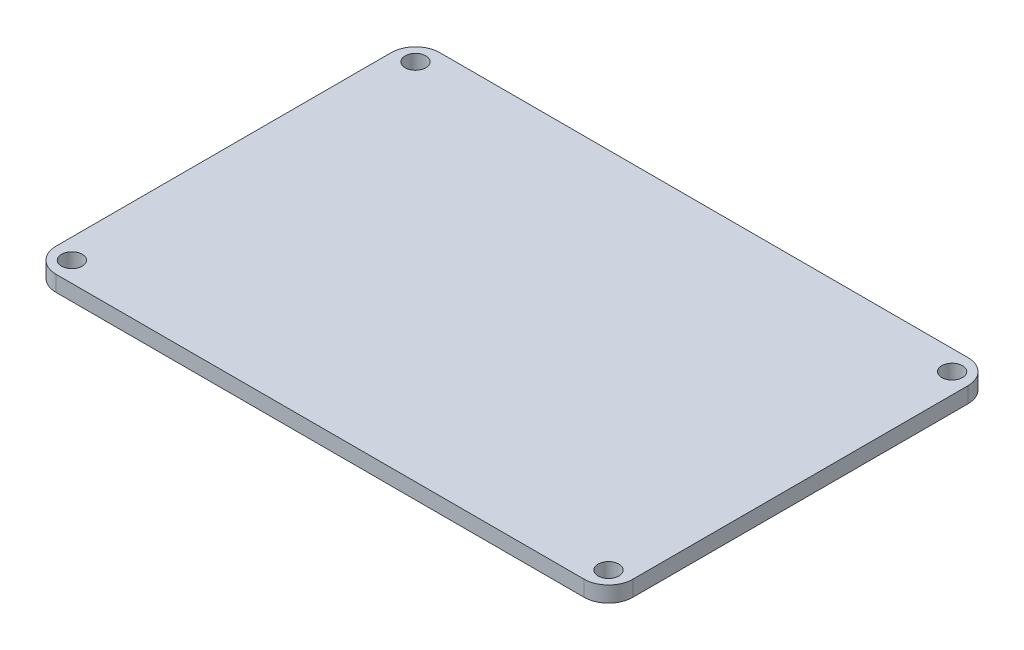
ISO-10303-21;
HEADER;
FILE_DESCRIPTION(('STEP AP214'),'2;1');
FILE_NAME('part.step','',(''),(''),'','','');
FILE_SCHEMA(('AUTOMOTIVE_DESIGN { 1 0 10303 214 1 1 1 1 }'));
ENDSEC;
DATA;
#1=APPLICATION_CONTEXT('core data for automotive mechanical design processes');
#2=APPLICATION_PROTOCOL_DEFINITION('international standard','automotive_design',2000,#1);
#3=PRODUCT_CONTEXT('',#1,'mechanical');
#4=PRODUCT('Part','Part','',(#3));
#5=PRODUCT_RELATED_PRODUCT_CATEGORY('part','',(#4));
#6=PRODUCT_DEFINITION_FORMATION('','',#4);
#7=PRODUCT_DEFINITION_CONTEXT('part definition',#1,'design');
#8=PRODUCT_DEFINITION('design','',#6,#7);
#9=PRODUCT_DEFINITION_SHAPE('','',#8);
#10=(LENGTH_UNIT() NAMED_UNIT(*) SI_UNIT(.MILLI.,.METRE.));
#11=(NAMED_UNIT(*) PLANE_ANGLE_UNIT() SI_UNIT($,.RADIAN.));
#12=(NAMED_UNIT(*) SI_UNIT($,.STERADIAN.) SOLID_ANGLE_UNIT());
#13=UNCERTAINTY_MEASURE_WITH_UNIT(LENGTH_MEASURE(1.E-05),#10,'distance_accuracy_value','');
#14=(GEOMETRIC_REPRESENTATION_CONTEXT(3) GLOBAL_UNCERTAINTY_ASSIGNED_CONTEXT((#13)) GLOBAL_UNIT_ASSIGNED_CONTEXT((#10,
#11,#12)) REPRESENTATION_CONTEXT('',''));
#15=CARTESIAN_POINT('',(0.,0.,0.));
#16=DIRECTION('',(0.,0.,1.));
#17=DIRECTION('',(1.,0.,0.));
#18=AXIS2_PLACEMENT_3D('',#15,#16,#17);
#19=CARTESIAN_POINT('',(0.,1.6383,0.));
#20=DIRECTION('',(1.,0.,0.));
#21=DIRECTION('',(0.,0.,-1.));
#22=AXIS2_PLACEMENT_3D('',#19,#20,#21);
#23=PLANE('',#22);
#24=DIRECTION('',(0.,0.,1.));
#25=VECTOR('',#24,1.);
#26=CARTESIAN_POINT('',(0.,1.6383,0.));
#27=LINE('',#26,#25);
#28=CARTESIAN_POINT('',(0.,1.6383,-37.465));
#29=VERTEX_POINT('',#28);
#30=CARTESIAN_POINT('',(0.,1.6383,-2.54));
#31=VERTEX_POINT('',#30);
#32=EDGE_CURVE('E128',#29,#31,#27,.T.);
#33=ORIENTED_EDGE('',*,*,#32,.F.);
#34=DIRECTION('',(0.,-1.,0.));
#35=VECTOR('',#34,1.);
#36=CARTESIAN_POINT('',(0.,1.6383,-37.465));
#37=LINE('',#36,#35);
#38=CARTESIAN_POINT('',(0.,0.,-37.465));
#39=VERTEX_POINT('',#38);
#40=EDGE_CURVE('E112',#29,#39,#37,.T.);
#41=ORIENTED_EDGE('',*,*,#40,.T.);
#42=DIRECTION('',(0.,0.,1.));
#43=VECTOR('',#42,1.);
#44=CARTESIAN_POINT('',(0.,0.,0.));
#45=LINE('',#44,#43);
#46=CARTESIAN_POINT('',(0.,0.,-2.54));
#47=VERTEX_POINT('',#46);
#48=EDGE_CURVE('E125',#39,#47,#45,.T.);
#49=ORIENTED_EDGE('',*,*,#48,.T.);
#50=DIRECTION('',(0.,-1.,0.));
#51=VECTOR('',#50,1.);
#52=CARTESIAN_POINT('',(0.,1.6383,-2.54));
#53=LINE('',#52,#51);
#54=EDGE_CURVE('E131',#47,#31,#53,.F.);
#55=ORIENTED_EDGE('',*,*,#54,.T.);
#56=EDGE_LOOP('',(#33,#41,#49,#55));
#57=FACE_BOUND('',#56,.T.);
#58=ADVANCED_FACE('F41',(#57),#23,.F.);
#59=CARTESIAN_POINT('',(0.,1.6383,0.));
#60=DIRECTION('',(0.,0.,-1.));
#61=DIRECTION('',(-1.,0.,0.));
#62=AXIS2_PLACEMENT_3D('',#59,#60,#61);
#63=PLANE('',#62);
#64=DIRECTION('',(1.,0.,0.));
#65=VECTOR('',#64,1.);
#66=CARTESIAN_POINT('',(0.,0.,0.));
#67=LINE('',#66,#65);
#68=CARTESIAN_POINT('',(2.54,0.,0.));
#69=VERTEX_POINT('',#68);
#70=CARTESIAN_POINT('',(57.5818,0.,0.));
#71=VERTEX_POINT('',#70);
#72=EDGE_CURVE('E136',#69,#71,#67,.T.);
#73=ORIENTED_EDGE('',*,*,#72,.T.);
#74=DIRECTION('',(0.,-1.,0.));
#75=VECTOR('',#74,1.);
#76=CARTESIAN_POINT('',(57.5818,1.6383,0.));
#77=LINE('',#76,#75);
#78=CARTESIAN_POINT('',(57.5818,1.6383,0.));
#79=VERTEX_POINT('',#78);
#80=EDGE_CURVE('E11',#71,#79,#77,.F.);
#81=ORIENTED_EDGE('',*,*,#80,.T.);
#82=DIRECTION('',(1.,0.,0.));
#83=VECTOR('',#82,1.);
#84=CARTESIAN_POINT('',(0.,1.6383,0.));
#85=LINE('',#84,#83);
#86=CARTESIAN_POINT('',(2.54,1.6383,0.));
#87=VERTEX_POINT('',#86);
#88=EDGE_CURVE('E193',#87,#79,#85,.T.);
#89=ORIENTED_EDGE('',*,*,#88,.F.);
#90=DIRECTION('',(0.,-1.,0.));
#91=VECTOR('',#90,1.);
#92=CARTESIAN_POINT('',(2.54,1.6383,0.));
#93=LINE('',#92,#91);
#94=EDGE_CURVE('E50',#87,#69,#93,.T.);
#95=ORIENTED_EDGE('',*,*,#94,.T.);
#96=EDGE_LOOP('',(#73,#81,#89,#95));
#97=FACE_BOUND('',#96,.T.);
#98=ADVANCED_FACE('F191',(#97),#63,.F.);
#99=CARTESIAN_POINT('',(60.1218,1.6383,0.));
#100=DIRECTION('',(-1.,0.,0.));
#101=DIRECTION('',(0.,0.,1.));
#102=AXIS2_PLACEMENT_3D('',#99,#100,#101);
#103=PLANE('',#102);
#104=DIRECTION('',(0.,0.,-1.));
#105=VECTOR('',#104,1.);
#106=CARTESIAN_POINT('',(60.1218,0.,0.));
#107=LINE('',#106,#105);
#108=CARTESIAN_POINT('',(60.1218,0.,-2.54));
#109=VERTEX_POINT('',#108);
#110=CARTESIAN_POINT('',(60.1218,0.,-37.465));
#111=VERTEX_POINT('',#110);
#112=EDGE_CURVE('E142',#109,#111,#107,.T.);
#113=ORIENTED_EDGE('',*,*,#112,.T.);
#114=DIRECTION('',(0.,-1.,0.));
#115=VECTOR('',#114,1.);
#116=CARTESIAN_POINT('',(60.1218,1.6383,-37.465));
#117=LINE('',#116,#115);
#118=CARTESIAN_POINT('',(60.1218,1.6383,-37.465));
#119=VERTEX_POINT('',#118);
#120=EDGE_CURVE('E57',#111,#119,#117,.F.);
#121=ORIENTED_EDGE('',*,*,#120,.T.);
#122=DIRECTION('',(0.,0.,-1.));
#123=VECTOR('',#122,1.);
#124=CARTESIAN_POINT('',(60.1218,1.6383,0.));
#125=LINE('',#124,#123);
#126=CARTESIAN_POINT('',(60.1218,1.6383,-2.54));
#127=VERTEX_POINT('',#126);
#128=EDGE_CURVE('E201',#127,#119,#125,.T.);
#129=ORIENTED_EDGE('',*,*,#128,.F.);
#130=DIRECTION('',(0.,-1.,0.));
#131=VECTOR('',#130,1.);
#132=CARTESIAN_POINT('',(60.1218,1.6383,-2.54));
#133=LINE('',#132,#131);
#134=EDGE_CURVE('E181',#127,#109,#133,.T.);
#135=ORIENTED_EDGE('',*,*,#134,.T.);
#136=EDGE_LOOP('',(#113,#121,#129,#135));
#137=FACE_BOUND('',#136,.T.);
#138=ADVANCED_FACE('F200',(#137),#103,.F.);
#139=CARTESIAN_POINT('',(0.,1.6383,-40.005));
#140=DIRECTION('',(0.,0.,1.));
#141=DIRECTION('',(1.,0.,0.));
#142=AXIS2_PLACEMENT_3D('',#139,#140,#141);
#143=PLANE('',#142);
#144=DIRECTION('',(-1.,0.,0.));
#145=VECTOR('',#144,1.);
#146=CARTESIAN_POINT('',(0.,0.,-40.005));
#147=LINE('',#146,#145);
#148=CARTESIAN_POINT('',(57.5818,0.,-40.005));
#149=VERTEX_POINT('',#148);
#150=CARTESIAN_POINT('',(2.54,0.,-40.005));
#151=VERTEX_POINT('',#150);
#152=EDGE_CURVE('E153',#149,#151,#147,.T.);
#153=ORIENTED_EDGE('',*,*,#152,.T.);
#154=DIRECTION('',(0.,-1.,0.));
#155=VECTOR('',#154,1.);
#156=CARTESIAN_POINT('',(2.54,1.6383,-40.005));
#157=LINE('',#156,#155);
#158=CARTESIAN_POINT('',(2.54,1.6383,-40.005));
#159=VERTEX_POINT('',#158);
#160=EDGE_CURVE('E113',#151,#159,#157,.F.);
#161=ORIENTED_EDGE('',*,*,#160,.T.);
#162=DIRECTION('',(-1.,0.,0.));
#163=VECTOR('',#162,1.);
#164=CARTESIAN_POINT('',(0.,1.6383,-40.005));
#165=LINE('',#164,#163);
#166=CARTESIAN_POINT('',(57.5818,1.6383,-40.005));
#167=VERTEX_POINT('',#166);
#168=EDGE_CURVE('E148',#167,#159,#165,.T.);
#169=ORIENTED_EDGE('',*,*,#168,.F.);
#170=DIRECTION('',(0.,-1.,0.));
#171=VECTOR('',#170,1.);
#172=CARTESIAN_POINT('',(57.5818,1.6383,-40.005));
#173=LINE('',#172,#171);
#174=EDGE_CURVE('E119',#167,#149,#173,.T.);
#175=ORIENTED_EDGE('',*,*,#174,.T.);
#176=EDGE_LOOP('',(#153,#161,#169,#175));
#177=FACE_BOUND('',#176,.T.);
#178=ADVANCED_FACE('F260',(#177),#143,.F.);
#179=CARTESIAN_POINT('',(0.,1.6383,0.));
#180=DIRECTION('',(0.,-1.,0.));
#181=DIRECTION('',(0.,0.,-1.));
#182=AXIS2_PLACEMENT_3D('',#179,#180,#181);
#183=PLANE('',#182);
#184=CARTESIAN_POINT('',(58.0263,1.6383,-2.0955));
#185=DIRECTION('',(0.,-1.,0.));
#186=DIRECTION('',(0.,0.,1.));
#187=AXIS2_PLACEMENT_3D('',#184,#185,#186);
#188=CIRCLE('',#187,1.0795);
#189=CARTESIAN_POINT('',(58.0263,1.6383,-1.016));
#190=VERTEX_POINT('',#189);
#191=EDGE_CURVE('E231',#190,#190,#188,.T.);
#192=ORIENTED_EDGE('',*,*,#191,.T.);
#193=EDGE_LOOP('',(#192));
#194=FACE_BOUND('',#193,.T.);
#195=CARTESIAN_POINT('',(58.0263,1.6383,-37.9095));
#196=DIRECTION('',(0.,1.,0.));
#197=DIRECTION('',(0.,0.,-1.));
#198=AXIS2_PLACEMENT_3D('',#195,#196,#197);
#199=CIRCLE('',#198,1.0795);
#200=CARTESIAN_POINT('',(58.0263,1.6383,-36.83));
#201=VERTEX_POINT('',#200);
#202=EDGE_CURVE('E223',#201,#201,#199,.T.);
#203=ORIENTED_EDGE('',*,*,#202,.F.);
#204=EDGE_LOOP('',(#203));
#205=FACE_BOUND('',#204,.T.);
#206=CARTESIAN_POINT('',(2.0955,1.6383,-37.9095));
#207=DIRECTION('',(0.,-1.,0.));
#208=DIRECTION('',(0.,0.,-1.));
#209=AXIS2_PLACEMENT_3D('',#206,#207,#208);
#210=CIRCLE('',#209,1.0795);
#211=CARTESIAN_POINT('',(2.0955,1.6383,-36.83));
#212=VERTEX_POINT('',#211);
#213=EDGE_CURVE('E215',#212,#212,#210,.T.);
#214=ORIENTED_EDGE('',*,*,#213,.T.);
#215=EDGE_LOOP('',(#214));
#216=FACE_BOUND('',#215,.T.);
#217=CARTESIAN_POINT('',(2.0955,1.6383,-2.0955));
#218=DIRECTION('',(0.,1.,0.));
#219=DIRECTION('',(0.,0.,1.));
#220=AXIS2_PLACEMENT_3D('',#217,#218,#219);
#221=CIRCLE('',#220,1.0795);
#222=CARTESIAN_POINT('',(2.0955,1.6383,-1.016));
#223=VERTEX_POINT('',#222);
#224=EDGE_CURVE('E145',#223,#223,#221,.T.);
#225=ORIENTED_EDGE('',*,*,#224,.F.);
#226=EDGE_LOOP('',(#225));
#227=FACE_BOUND('',#226,.T.);
#228=ORIENTED_EDGE('',*,*,#168,.T.);
#229=CARTESIAN_POINT('',(2.54,1.6383,-37.465));
#230=DIRECTION('',(0.,-1.,0.));
#231=DIRECTION('',(0.,0.,-1.));
#232=AXIS2_PLACEMENT_3D('',#229,#230,#231);
#233=CIRCLE('',#232,2.54);
#234=EDGE_CURVE('E178',#159,#29,#233,.F.);
#235=ORIENTED_EDGE('',*,*,#234,.T.);
#236=ORIENTED_EDGE('',*,*,#32,.T.);
#237=CARTESIAN_POINT('',(2.54,1.6383,-2.54));
#238=DIRECTION('',(0.,-1.,0.));
#239=DIRECTION('',(0.,0.,-1.));
#240=AXIS2_PLACEMENT_3D('',#237,#238,#239);
#241=CIRCLE('',#240,2.54);
#242=EDGE_CURVE('E170',#31,#87,#241,.F.);
#243=ORIENTED_EDGE('',*,*,#242,.T.);
#244=ORIENTED_EDGE('',*,*,#88,.T.);
#245=CARTESIAN_POINT('',(57.5818,1.6383,-2.54));
#246=DIRECTION('',(0.,-1.,0.));
#247=DIRECTION('',(0.,0.,-1.));
#248=AXIS2_PLACEMENT_3D('',#245,#246,#247);
#249=CIRCLE('',#248,2.54);
#250=EDGE_CURVE('E64',#79,#127,#249,.F.);
#251=ORIENTED_EDGE('',*,*,#250,.T.);
#252=ORIENTED_EDGE('',*,*,#128,.T.);
#253=CARTESIAN_POINT('',(57.5818,1.6383,-37.465));
#254=DIRECTION('',(0.,-1.,0.));
#255=DIRECTION('',(0.,0.,-1.));
#256=AXIS2_PLACEMENT_3D('',#253,#254,#255);
#257=CIRCLE('',#256,2.54);
#258=EDGE_CURVE('E175',#119,#167,#257,.F.);
#259=ORIENTED_EDGE('',*,*,#258,.T.);
#260=EDGE_LOOP('',(#228,#235,#236,#243,#244,#251,#252,#259));
#261=FACE_BOUND('',#260,.T.);
#262=ADVANCED_FACE('F244',(#194,#205,#216,#227,#261),#183,.F.);
#263=CARTESIAN_POINT('',(0.,0.,0.));
#264=DIRECTION('',(0.,-1.,0.));
#265=DIRECTION('',(0.,0.,-1.));
#266=AXIS2_PLACEMENT_3D('',#263,#264,#265);
#267=PLANE('',#266);
#268=CARTESIAN_POINT('',(58.0263,0.,-2.0955));
#269=DIRECTION('',(0.,-1.,0.));
#270=DIRECTION('',(0.,0.,1.));
#271=AXIS2_PLACEMENT_3D('',#268,#269,#270);
#272=CIRCLE('',#271,1.0795);
#273=CARTESIAN_POINT('',(58.0263,0.,-1.016));
#274=VERTEX_POINT('',#273);
#275=EDGE_CURVE('E227',#274,#274,#272,.T.);
#276=ORIENTED_EDGE('',*,*,#275,.F.);
#277=EDGE_LOOP('',(#276));
#278=FACE_BOUND('',#277,.T.);
#279=CARTESIAN_POINT('',(58.0263,0.,-37.9095));
#280=DIRECTION('',(0.,1.,0.));
#281=DIRECTION('',(0.,0.,-1.));
#282=AXIS2_PLACEMENT_3D('',#279,#280,#281);
#283=CIRCLE('',#282,1.0795);
#284=CARTESIAN_POINT('',(58.0263,0.,-36.83));
#285=VERTEX_POINT('',#284);
#286=EDGE_CURVE('E219',#285,#285,#283,.T.);
#287=ORIENTED_EDGE('',*,*,#286,.T.);
#288=EDGE_LOOP('',(#287));
#289=FACE_BOUND('',#288,.T.);
#290=CARTESIAN_POINT('',(2.0955,0.,-37.9095));
#291=DIRECTION('',(0.,-1.,0.));
#292=DIRECTION('',(0.,0.,-1.));
#293=AXIS2_PLACEMENT_3D('',#290,#291,#292);
#294=CIRCLE('',#293,1.0795);
#295=CARTESIAN_POINT('',(2.0955,0.,-36.83));
#296=VERTEX_POINT('',#295);
#297=EDGE_CURVE('E213',#296,#296,#294,.T.);
#298=ORIENTED_EDGE('',*,*,#297,.F.);
#299=EDGE_LOOP('',(#298));
#300=FACE_BOUND('',#299,.T.);
#301=CARTESIAN_POINT('',(2.0955,0.,-2.0955));
#302=DIRECTION('',(0.,1.,0.));
#303=DIRECTION('',(0.,0.,1.));
#304=AXIS2_PLACEMENT_3D('',#301,#302,#303);
#305=CIRCLE('',#304,1.0795);
#306=CARTESIAN_POINT('',(2.0955,0.,-1.016));
#307=VERTEX_POINT('',#306);
#308=EDGE_CURVE('E137',#307,#307,#305,.T.);
#309=ORIENTED_EDGE('',*,*,#308,.T.);
#310=EDGE_LOOP('',(#309));
#311=FACE_BOUND('',#310,.T.);
#312=ORIENTED_EDGE('',*,*,#48,.F.);
#313=CARTESIAN_POINT('',(2.54,0.,-37.465));
#314=DIRECTION('',(0.,-1.,0.));
#315=DIRECTION('',(0.,0.,-1.));
#316=AXIS2_PLACEMENT_3D('',#313,#314,#315);
#317=CIRCLE('',#316,2.54);
#318=EDGE_CURVE('E108',#39,#151,#317,.T.);
#319=ORIENTED_EDGE('',*,*,#318,.T.);
#320=ORIENTED_EDGE('',*,*,#152,.F.);
#321=CARTESIAN_POINT('',(57.5818,0.,-37.465));
#322=DIRECTION('',(0.,-1.,0.));
#323=DIRECTION('',(0.,0.,-1.));
#324=AXIS2_PLACEMENT_3D('',#321,#322,#323);
#325=CIRCLE('',#324,2.54);
#326=EDGE_CURVE('E120',#149,#111,#325,.T.);
#327=ORIENTED_EDGE('',*,*,#326,.T.);
#328=ORIENTED_EDGE('',*,*,#112,.F.);
#329=CARTESIAN_POINT('',(57.5818,0.,-2.54));
#330=DIRECTION('',(0.,-1.,0.));
#331=DIRECTION('',(0.,0.,-1.));
#332=AXIS2_PLACEMENT_3D('',#329,#330,#331);
#333=CIRCLE('',#332,2.54);
#334=EDGE_CURVE('E160',#109,#71,#333,.T.);
#335=ORIENTED_EDGE('',*,*,#334,.T.);
#336=ORIENTED_EDGE('',*,*,#72,.F.);
#337=CARTESIAN_POINT('',(2.54,0.,-2.54));
#338=DIRECTION('',(0.,-1.,0.));
#339=DIRECTION('',(0.,0.,-1.));
#340=AXIS2_PLACEMENT_3D('',#337,#338,#339);
#341=CIRCLE('',#340,2.54);
#342=EDGE_CURVE('E130',#69,#47,#341,.T.);
#343=ORIENTED_EDGE('',*,*,#342,.T.);
#344=EDGE_LOOP('',(#312,#319,#320,#327,#328,#335,#336,#343));
#345=FACE_BOUND('',#344,.T.);
#346=ADVANCED_FACE('F133',(#278,#289,#300,#311,#345),#267,.T.);
#347=CARTESIAN_POINT('',(2.54,1.6383,-37.465));
#348=DIRECTION('',(0.,-1.,0.));
#349=DIRECTION('',(0.,0.,-1.));
#350=AXIS2_PLACEMENT_3D('',#347,#348,#349);
#351=CYLINDRICAL_SURFACE('',#350,2.54);
#352=ORIENTED_EDGE('',*,*,#234,.F.);
#353=ORIENTED_EDGE('',*,*,#160,.F.);
#354=ORIENTED_EDGE('',*,*,#318,.F.);
#355=ORIENTED_EDGE('',*,*,#40,.F.);
#356=EDGE_LOOP('',(#352,#353,#354,#355));
#357=FACE_BOUND('',#356,.T.);
#358=ADVANCED_FACE('F111',(#357),#351,.T.);
#359=CARTESIAN_POINT('',(57.5818,1.6383,-37.465));
#360=DIRECTION('',(0.,-1.,0.));
#361=DIRECTION('',(0.,0.,-1.));
#362=AXIS2_PLACEMENT_3D('',#359,#360,#361);
#363=CYLINDRICAL_SURFACE('',#362,2.54);
#364=ORIENTED_EDGE('',*,*,#258,.F.);
#365=ORIENTED_EDGE('',*,*,#120,.F.);
#366=ORIENTED_EDGE('',*,*,#326,.F.);
#367=ORIENTED_EDGE('',*,*,#174,.F.);
#368=EDGE_LOOP('',(#364,#365,#366,#367));
#369=FACE_BOUND('',#368,.T.);
#370=ADVANCED_FACE('F267',(#369),#363,.T.);
#371=CARTESIAN_POINT('',(57.5818,1.6383,-2.54));
#372=DIRECTION('',(0.,-1.,0.));
#373=DIRECTION('',(0.,0.,-1.));
#374=AXIS2_PLACEMENT_3D('',#371,#372,#373);
#375=CYLINDRICAL_SURFACE('',#374,2.54);
#376=ORIENTED_EDGE('',*,*,#250,.F.);
#377=ORIENTED_EDGE('',*,*,#80,.F.);
#378=ORIENTED_EDGE('',*,*,#334,.F.);
#379=ORIENTED_EDGE('',*,*,#134,.F.);
#380=EDGE_LOOP('',(#376,#377,#378,#379));
#381=FACE_BOUND('',#380,.T.);
#382=ADVANCED_FACE('F199',(#381),#375,.T.);
#383=CARTESIAN_POINT('',(2.54,1.6383,-2.54));
#384=DIRECTION('',(0.,-1.,0.));
#385=DIRECTION('',(0.,0.,-1.));
#386=AXIS2_PLACEMENT_3D('',#383,#384,#385);
#387=CYLINDRICAL_SURFACE('',#386,2.54);
#388=ORIENTED_EDGE('',*,*,#242,.F.);
#389=ORIENTED_EDGE('',*,*,#54,.F.);
#390=ORIENTED_EDGE('',*,*,#342,.F.);
#391=ORIENTED_EDGE('',*,*,#94,.F.);
#392=EDGE_LOOP('',(#388,#389,#390,#391));
#393=FACE_BOUND('',#392,.T.);
#394=ADVANCED_FACE('F43',(#393),#387,.T.);
#395=CARTESIAN_POINT('',(2.0955,0.,-2.0955));
#396=DIRECTION('',(0.,1.,0.));
#397=DIRECTION('',(0.,0.,1.));
#398=AXIS2_PLACEMENT_3D('',#395,#396,#397);
#399=CYLINDRICAL_SURFACE('',#398,1.0795);
#400=CARTESIAN_POINT('',(2.0955,0.,-1.016));
#401=CARTESIAN_POINT('',(2.0955,0.017065625,-1.016));
#402=CARTESIAN_POINT('',(2.0955,0.03413125,-1.016));
#403=CARTESIAN_POINT('',(2.0955,0.0682625,-1.016));
#404=CARTESIAN_POINT('',(2.0955,0.085328125,-1.016));
#405=CARTESIAN_POINT('',(2.0955,0.119459375,-1.016));
#406=CARTESIAN_POINT('',(2.0955,0.136525,-1.016));
#407=CARTESIAN_POINT('',(2.0955,0.17065625,-1.016));
#408=CARTESIAN_POINT('',(2.0955,0.187721875,-1.016));
#409=CARTESIAN_POINT('',(2.0955,0.221853125,-1.016));
#410=CARTESIAN_POINT('',(2.0955,0.23891875,-1.016));
#411=CARTESIAN_POINT('',(2.0955,0.27305,-1.016));
#412=CARTESIAN_POINT('',(2.0955,0.290115625,-1.016));
#413=CARTESIAN_POINT('',(2.0955,0.324246875,-1.016));
#414=CARTESIAN_POINT('',(2.0955,0.3413125,-1.016));
#415=CARTESIAN_POINT('',(2.0955,0.37544375,-1.016));
#416=CARTESIAN_POINT('',(2.0955,0.392509375,-1.016));
#417=CARTESIAN_POINT('',(2.0955,0.426640625,-1.016));
#418=CARTESIAN_POINT('',(2.0955,0.44370625,-1.016));
#419=CARTESIAN_POINT('',(2.0955,0.4778375,-1.016));
#420=CARTESIAN_POINT('',(2.0955,0.494903125,-1.016));
#421=CARTESIAN_POINT('',(2.0955,0.529034375,-1.016));
#422=CARTESIAN_POINT('',(2.0955,0.5461,-1.016));
#423=CARTESIAN_POINT('',(2.0955,0.58023125,-1.016));
#424=CARTESIAN_POINT('',(2.0955,0.597296875,-1.016));
#425=CARTESIAN_POINT('',(2.0955,0.631428125,-1.016));
#426=CARTESIAN_POINT('',(2.0955,0.64849375,-1.016));
#427=CARTESIAN_POINT('',(2.0955,0.682625,-1.016));
#428=CARTESIAN_POINT('',(2.0955,0.699690625,-1.016));
#429=CARTESIAN_POINT('',(2.0955,0.733821875,-1.016));
#430=CARTESIAN_POINT('',(2.0955,0.7508875,-1.016));
#431=CARTESIAN_POINT('',(2.0955,0.78501875,-1.016));
#432=CARTESIAN_POINT('',(2.0955,0.802084375,-1.016));
#433=CARTESIAN_POINT('',(2.0955,0.836215625,-1.016));
#434=CARTESIAN_POINT('',(2.0955,0.85328125,-1.016));
#435=CARTESIAN_POINT('',(2.0955,0.8874125,-1.016));
#436=CARTESIAN_POINT('',(2.0955,0.904478125,-1.016));
#437=CARTESIAN_POINT('',(2.0955,0.938609375,-1.016));
#438=CARTESIAN_POINT('',(2.0955,0.955675,-1.016));
#439=CARTESIAN_POINT('',(2.0955,0.98980625,-1.016));
#440=CARTESIAN_POINT('',(2.0955,1.006871875,-1.016));
#441=CARTESIAN_POINT('',(2.0955,1.041003125,-1.016));
#442=CARTESIAN_POINT('',(2.0955,1.05806875,-1.016));
#443=CARTESIAN_POINT('',(2.0955,1.0922,-1.016));
#444=CARTESIAN_POINT('',(2.0955,1.109265625,-1.016));
#445=CARTESIAN_POINT('',(2.0955,1.143396875,-1.016));
#446=CARTESIAN_POINT('',(2.0955,1.1604625,-1.016));
#447=CARTESIAN_POINT('',(2.0955,1.19459375,-1.016));
#448=CARTESIAN_POINT('',(2.0955,1.211659375,-1.016));
#449=CARTESIAN_POINT('',(2.0955,1.245790625,-1.016));
#450=CARTESIAN_POINT('',(2.0955,1.26285625,-1.016));
#451=CARTESIAN_POINT('',(2.0955,1.2969875,-1.016));
#452=CARTESIAN_POINT('',(2.0955,1.314053125,-1.016));
#453=CARTESIAN_POINT('',(2.0955,1.348184375,-1.016));
#454=CARTESIAN_POINT('',(2.0955,1.36525,-1.016));
#455=CARTESIAN_POINT('',(2.0955,1.39938125,-1.016));
#456=CARTESIAN_POINT('',(2.0955,1.416446875,-1.016));
#457=CARTESIAN_POINT('',(2.0955,1.450578125,-1.016));
#458=CARTESIAN_POINT('',(2.0955,1.46764375,-1.016));
#459=CARTESIAN_POINT('',(2.0955,1.501775,-1.016));
#460=CARTESIAN_POINT('',(2.0955,1.518840625,-1.016));
#461=CARTESIAN_POINT('',(2.0955,1.552971875,-1.016));
#462=CARTESIAN_POINT('',(2.0955,1.5700375,-1.016));
#463=CARTESIAN_POINT('',(2.0955,1.60416875,-1.016));
#464=CARTESIAN_POINT('',(2.0955,1.621234375,-1.016));
#465=CARTESIAN_POINT('',(2.0955,1.6383,-1.016));
#466=B_SPLINE_CURVE_WITH_KNOTS('',3,(#400,#401,#402,#403,#404,#405,#406,#407,#408,#409,#410,
#411,#412,#413,#414,#415,#416,#417,#418,#419,#420,#421,#422,#423,#424,#425,#426,#427,#428,#429,
#430,#431,#432,#433,#434,#435,#436,#437,#438,#439,#440,#441,#442,#443,#444,#445,#446,#447,#448,
#449,#450,#451,#452,#453,#454,#455,#456,#457,#458,#459,#460,#461,#462,#463,#464,#465),
.UNSPECIFIED.,.F.,.F.,(4,2,2,2,2,2,2,2,2,2,2,2,2,2,2,2,2,2,2,2,2,2,2,2,2,2,2,2,2,2,2,2,4),(0.,
0.051196875,0.10239375,0.153590625,0.2047875,0.255984375,0.30718125,0.358378125,0.409575,
0.460771875,0.51196875,0.563165625,0.6143625,0.665559375,0.71675625,0.767953125,0.81915,
0.870346875,0.92154375,0.972740625,1.0239375,1.075134375,1.12633125,1.177528125,1.228725,
1.279921875,1.33111875,1.382315625,1.4335125,1.484709375,1.53590625,1.587103125,1.6383),.UNSPECIFIED.);
#467=EDGE_CURVE('BSEAM252',#307,#223,#466,.T.);
#468=ORIENTED_EDGE('',*,*,#308,.F.);
#469=ORIENTED_EDGE('',*,*,#224,.T.);
#470=ORIENTED_EDGE('',*,*,#467,.T.);
#471=ORIENTED_EDGE('',*,*,#467,.F.);
#472=EDGE_LOOP('',(#468,#470,#469,#471));
#473=FACE_BOUND('',#472,.T.);
#474=ADVANCED_FACE('F252',(#473),#399,.F.);
#475=CARTESIAN_POINT('',(2.0955,0.,-37.9095));
#476=DIRECTION('',(0.,1.,0.));
#477=DIRECTION('',(0.,0.,1.));
#478=AXIS2_PLACEMENT_3D('',#475,#476,#477);
#479=CYLINDRICAL_SURFACE('',#478,1.0795);
#480=CARTESIAN_POINT('',(2.0955,0.,-36.83));
#481=CARTESIAN_POINT('',(2.0955,0.017065625,-36.83));
#482=CARTESIAN_POINT('',(2.0955,0.03413125,-36.83));
#483=CARTESIAN_POINT('',(2.0955,0.0682625,-36.83));
#484=CARTESIAN_POINT('',(2.0955,0.085328125,-36.83));
#485=CARTESIAN_POINT('',(2.0955,0.119459375,-36.83));
#486=CARTESIAN_POINT('',(2.0955,0.136525,-36.83));
#487=CARTESIAN_POINT('',(2.0955,0.17065625,-36.83));
#488=CARTESIAN_POINT('',(2.0955,0.187721875,-36.83));
#489=CARTESIAN_POINT('',(2.0955,0.221853125,-36.83));
#490=CARTESIAN_POINT('',(2.0955,0.23891875,-36.83));
#491=CARTESIAN_POINT('',(2.0955,0.27305,-36.83));
#492=CARTESIAN_POINT('',(2.0955,0.290115625,-36.83));
#493=CARTESIAN_POINT('',(2.0955,0.324246875,-36.83));
#494=CARTESIAN_POINT('',(2.0955,0.3413125,-36.83));
#495=CARTESIAN_POINT('',(2.0955,0.37544375,-36.83));
#496=CARTESIAN_POINT('',(2.0955,0.392509375,-36.83));
#497=CARTESIAN_POINT('',(2.0955,0.426640625,-36.83));
#498=CARTESIAN_POINT('',(2.0955,0.44370625,-36.83));
#499=CARTESIAN_POINT('',(2.0955,0.4778375,-36.83));
#500=CARTESIAN_POINT('',(2.0955,0.494903125,-36.83));
#501=CARTESIAN_POINT('',(2.0955,0.529034375,-36.83));
#502=CARTESIAN_POINT('',(2.0955,0.5461,-36.83));
#503=CARTESIAN_POINT('',(2.0955,0.58023125,-36.83));
#504=CARTESIAN_POINT('',(2.0955,0.597296875,-36.83));
#505=CARTESIAN_POINT('',(2.0955,0.631428125,-36.83));
#506=CARTESIAN_POINT('',(2.0955,0.64849375,-36.83));
#507=CARTESIAN_POINT('',(2.0955,0.682625,-36.83));
#508=CARTESIAN_POINT('',(2.0955,0.699690625,-36.83));
#509=CARTESIAN_POINT('',(2.0955,0.733821875,-36.83));
#510=CARTESIAN_POINT('',(2.0955,0.7508875,-36.83));
#511=CARTESIAN_POINT('',(2.0955,0.78501875,-36.83));
#512=CARTESIAN_POINT('',(2.0955,0.802084375,-36.83));
#513=CARTESIAN_POINT('',(2.0955,0.836215625,-36.83));
#514=CARTESIAN_POINT('',(2.0955,0.85328125,-36.83));
#515=CARTESIAN_POINT('',(2.0955,0.8874125,-36.83));
#516=CARTESIAN_POINT('',(2.0955,0.904478125,-36.83));
#517=CARTESIAN_POINT('',(2.0955,0.938609375,-36.83));
#518=CARTESIAN_POINT('',(2.0955,0.955675,-36.83));
#519=CARTESIAN_POINT('',(2.0955,0.98980625,-36.83));
#520=CARTESIAN_POINT('',(2.0955,1.006871875,-36.83));
#521=CARTESIAN_POINT('',(2.0955,1.041003125,-36.83));
#522=CARTESIAN_POINT('',(2.0955,1.05806875,-36.83));
#523=CARTESIAN_POINT('',(2.0955,1.0922,-36.83));
#524=CARTESIAN_POINT('',(2.0955,1.109265625,-36.83));
#525=CARTESIAN_POINT('',(2.0955,1.143396875,-36.83));
#526=CARTESIAN_POINT('',(2.0955,1.1604625,-36.83));
#527=CARTESIAN_POINT('',(2.0955,1.19459375,-36.83));
#528=CARTESIAN_POINT('',(2.0955,1.211659375,-36.83));
#529=CARTESIAN_POINT('',(2.0955,1.245790625,-36.83));
#530=CARTESIAN_POINT('',(2.0955,1.26285625,-36.83));
#531=CARTESIAN_POINT('',(2.0955,1.2969875,-36.83));
#532=CARTESIAN_POINT('',(2.0955,1.314053125,-36.83));
#533=CARTESIAN_POINT('',(2.0955,1.348184375,-36.83));
#534=CARTESIAN_POINT('',(2.0955,1.36525,-36.83));
#535=CARTESIAN_POINT('',(2.0955,1.39938125,-36.83));
#536=CARTESIAN_POINT('',(2.0955,1.416446875,-36.83));
#537=CARTESIAN_POINT('',(2.0955,1.450578125,-36.83));
#538=CARTESIAN_POINT('',(2.0955,1.46764375,-36.83));
#539=CARTESIAN_POINT('',(2.0955,1.501775,-36.83));
#540=CARTESIAN_POINT('',(2.0955,1.518840625,-36.83));
#541=CARTESIAN_POINT('',(2.0955,1.552971875,-36.83));
#542=CARTESIAN_POINT('',(2.0955,1.5700375,-36.83));
#543=CARTESIAN_POINT('',(2.0955,1.60416875,-36.83));
#544=CARTESIAN_POINT('',(2.0955,1.621234375,-36.83));
#545=CARTESIAN_POINT('',(2.0955,1.6383,-36.83));
#546=B_SPLINE_CURVE_WITH_KNOTS('',3,(#480,#481,#482,#483,#484,#485,#486,#487,#488,#489,#490,
#491,#492,#493,#494,#495,#496,#497,#498,#499,#500,#501,#502,#503,#504,#505,#506,#507,#508,#509,
#510,#511,#512,#513,#514,#515,#516,#517,#518,#519,#520,#521,#522,#523,#524,#525,#526,#527,#528,
#529,#530,#531,#532,#533,#534,#535,#536,#537,#538,#539,#540,#541,#542,#543,#544,#545),
.UNSPECIFIED.,.F.,.F.,(4,2,2,2,2,2,2,2,2,2,2,2,2,2,2,2,2,2,2,2,2,2,2,2,2,2,2,2,2,2,2,2,4),(0.,
0.051196875,0.10239375,0.153590625,0.2047875,0.255984375,0.30718125,0.358378125,0.409575,
0.460771875,0.51196875,0.563165625,0.6143625,0.665559375,0.71675625,0.767953125,0.81915,
0.870346875,0.92154375,0.972740625,1.0239375,1.075134375,1.12633125,1.177528125,1.228725,
1.279921875,1.33111875,1.382315625,1.4335125,1.484709375,1.53590625,1.587103125,1.6383),.UNSPECIFIED.);
#547=EDGE_CURVE('BSEAM255',#296,#212,#546,.T.);
#548=ORIENTED_EDGE('',*,*,#297,.T.);
#549=ORIENTED_EDGE('',*,*,#213,.F.);
#550=ORIENTED_EDGE('',*,*,#547,.T.);
#551=ORIENTED_EDGE('',*,*,#547,.F.);
#552=EDGE_LOOP('',(#548,#550,#549,#551));
#553=FACE_BOUND('',#552,.T.);
#554=ADVANCED_FACE('F255',(#553),#479,.F.);
#555=CARTESIAN_POINT('',(58.0263,0.,-37.9095));
#556=DIRECTION('',(0.,1.,0.));
#557=DIRECTION('',(0.,0.,1.));
#558=AXIS2_PLACEMENT_3D('',#555,#556,#557);
#559=CYLINDRICAL_SURFACE('',#558,1.0795);
#560=CARTESIAN_POINT('',(58.0263,0.,-36.83));
#561=CARTESIAN_POINT('',(58.0263,0.017065625,-36.83));
#562=CARTESIAN_POINT('',(58.0263,0.03413125,-36.83));
#563=CARTESIAN_POINT('',(58.0263,0.0682625,-36.83));
#564=CARTESIAN_POINT('',(58.0263,0.085328125,-36.83));
#565=CARTESIAN_POINT('',(58.0263,0.119459375,-36.83));
#566=CARTESIAN_POINT('',(58.0263,0.136525,-36.83));
#567=CARTESIAN_POINT('',(58.0263,0.17065625,-36.83));
#568=CARTESIAN_POINT('',(58.0263,0.187721875,-36.83));
#569=CARTESIAN_POINT('',(58.0263,0.221853125,-36.83));
#570=CARTESIAN_POINT('',(58.0263,0.23891875,-36.83));
#571=CARTESIAN_POINT('',(58.0263,0.27305,-36.83));
#572=CARTESIAN_POINT('',(58.0263,0.290115625,-36.83));
#573=CARTESIAN_POINT('',(58.0263,0.324246875,-36.83));
#574=CARTESIAN_POINT('',(58.0263,0.3413125,-36.83));
#575=CARTESIAN_POINT('',(58.0263,0.37544375,-36.83));
#576=CARTESIAN_POINT('',(58.0263,0.392509375,-36.83));
#577=CARTESIAN_POINT('',(58.0263,0.426640625,-36.83));
#578=CARTESIAN_POINT('',(58.0263,0.44370625,-36.83));
#579=CARTESIAN_POINT('',(58.0263,0.4778375,-36.83));
#580=CARTESIAN_POINT('',(58.0263,0.494903125,-36.83));
#581=CARTESIAN_POINT('',(58.0263,0.529034375,-36.83));
#582=CARTESIAN_POINT('',(58.0263,0.5461,-36.83));
#583=CARTESIAN_POINT('',(58.0263,0.58023125,-36.83));
#584=CARTESIAN_POINT('',(58.0263,0.597296875,-36.83));
#585=CARTESIAN_POINT('',(58.0263,0.631428125,-36.83));
#586=CARTESIAN_POINT('',(58.0263,0.64849375,-36.83));
#587=CARTESIAN_POINT('',(58.0263,0.682625,-36.83));
#588=CARTESIAN_POINT('',(58.0263,0.699690625,-36.83));
#589=CARTESIAN_POINT('',(58.0263,0.733821875,-36.83));
#590=CARTESIAN_POINT('',(58.0263,0.7508875,-36.83));
#591=CARTESIAN_POINT('',(58.0263,0.78501875,-36.83));
#592=CARTESIAN_POINT('',(58.0263,0.802084375,-36.83));
#593=CARTESIAN_POINT('',(58.0263,0.836215625,-36.83));
#594=CARTESIAN_POINT('',(58.0263,0.85328125,-36.83));
#595=CARTESIAN_POINT('',(58.0263,0.8874125,-36.83));
#596=CARTESIAN_POINT('',(58.0263,0.904478125,-36.83));
#597=CARTESIAN_POINT('',(58.0263,0.938609375,-36.83));
#598=CARTESIAN_POINT('',(58.0263,0.955675,-36.83));
#599=CARTESIAN_POINT('',(58.0263,0.98980625,-36.83));
#600=CARTESIAN_POINT('',(58.0263,1.006871875,-36.83));
#601=CARTESIAN_POINT('',(58.0263,1.041003125,-36.83));
#602=CARTESIAN_POINT('',(58.0263,1.05806875,-36.83));
#603=CARTESIAN_POINT('',(58.0263,1.0922,-36.83));
#604=CARTESIAN_POINT('',(58.0263,1.109265625,-36.83));
#605=CARTESIAN_POINT('',(58.0263,1.143396875,-36.83));
#606=CARTESIAN_POINT('',(58.0263,1.1604625,-36.83));
#607=CARTESIAN_POINT('',(58.0263,1.19459375,-36.83));
#608=CARTESIAN_POINT('',(58.0263,1.211659375,-36.83));
#609=CARTESIAN_POINT('',(58.0263,1.245790625,-36.83));
#610=CARTESIAN_POINT('',(58.0263,1.26285625,-36.83));
#611=CARTESIAN_POINT('',(58.0263,1.2969875,-36.83));
#612=CARTESIAN_POINT('',(58.0263,1.314053125,-36.83));
#613=CARTESIAN_POINT('',(58.0263,1.348184375,-36.83));
#614=CARTESIAN_POINT('',(58.0263,1.36525,-36.83));
#615=CARTESIAN_POINT('',(58.0263,1.39938125,-36.83));
#616=CARTESIAN_POINT('',(58.0263,1.416446875,-36.83));
#617=CARTESIAN_POINT('',(58.0263,1.450578125,-36.83));
#618=CARTESIAN_POINT('',(58.0263,1.46764375,-36.83));
#619=CARTESIAN_POINT('',(58.0263,1.501775,-36.83));
#620=CARTESIAN_POINT('',(58.0263,1.518840625,-36.83));
#621=CARTESIAN_POINT('',(58.0263,1.552971875,-36.83));
#622=CARTESIAN_POINT('',(58.0263,1.5700375,-36.83));
#623=CARTESIAN_POINT('',(58.0263,1.60416875,-36.83));
#624=CARTESIAN_POINT('',(58.0263,1.621234375,-36.83));
#625=CARTESIAN_POINT('',(58.0263,1.6383,-36.83));
#626=B_SPLINE_CURVE_WITH_KNOTS('',3,(#560,#561,#562,#563,#564,#565,#566,#567,#568,#569,#570,
#571,#572,#573,#574,#575,#576,#577,#578,#579,#580,#581,#582,#583,#584,#585,#586,#587,#588,#589,
#590,#591,#592,#593,#594,#595,#596,#597,#598,#599,#600,#601,#602,#603,#604,#605,#606,#607,#608,
#609,#610,#611,#612,#613,#614,#615,#616,#617,#618,#619,#620,#621,#622,#623,#624,#625),
.UNSPECIFIED.,.F.,.F.,(4,2,2,2,2,2,2,2,2,2,2,2,2,2,2,2,2,2,2,2,2,2,2,2,2,2,2,2,2,2,2,2,4),(0.,
0.051196875,0.10239375,0.153590625,0.2047875,0.255984375,0.30718125,0.358378125,0.409575,
0.460771875,0.51196875,0.563165625,0.6143625,0.665559375,0.71675625,0.767953125,0.81915,
0.870346875,0.92154375,0.972740625,1.0239375,1.075134375,1.12633125,1.177528125,1.228725,
1.279921875,1.33111875,1.382315625,1.4335125,1.484709375,1.53590625,1.587103125,1.6383),.UNSPECIFIED.);
#627=EDGE_CURVE('BSEAM288',#285,#201,#626,.T.);
#628=ORIENTED_EDGE('',*,*,#286,.F.);
#629=ORIENTED_EDGE('',*,*,#202,.T.);
#630=ORIENTED_EDGE('',*,*,#627,.T.);
#631=ORIENTED_EDGE('',*,*,#627,.F.);
#632=EDGE_LOOP('',(#628,#630,#629,#631));
#633=FACE_BOUND('',#632,.T.);
#634=ADVANCED_FACE('F288',(#633),#559,.F.);
#635=CARTESIAN_POINT('',(58.0263,0.,-2.0955));
#636=DIRECTION('',(0.,1.,0.));
#637=DIRECTION('',(0.,0.,1.));
#638=AXIS2_PLACEMENT_3D('',#635,#636,#637);
#639=CYLINDRICAL_SURFACE('',#638,1.0795);
#640=CARTESIAN_POINT('',(58.0263,0.,-1.016));
#641=CARTESIAN_POINT('',(58.0263,0.017065625,-1.016));
#642=CARTESIAN_POINT('',(58.0263,0.03413125,-1.016));
#643=CARTESIAN_POINT('',(58.0263,0.0682625,-1.016));
#644=CARTESIAN_POINT('',(58.0263,0.085328125,-1.016));
#645=CARTESIAN_POINT('',(58.0263,0.119459375,-1.016));
#646=CARTESIAN_POINT('',(58.0263,0.136525,-1.016));
#647=CARTESIAN_POINT('',(58.0263,0.17065625,-1.016));
#648=CARTESIAN_POINT('',(58.0263,0.187721875,-1.016));
#649=CARTESIAN_POINT('',(58.0263,0.221853125,-1.016));
#650=CARTESIAN_POINT('',(58.0263,0.23891875,-1.016));
#651=CARTESIAN_POINT('',(58.0263,0.27305,-1.016));
#652=CARTESIAN_POINT('',(58.0263,0.290115625,-1.016));
#653=CARTESIAN_POINT('',(58.0263,0.324246875,-1.016));
#654=CARTESIAN_POINT('',(58.0263,0.3413125,-1.016));
#655=CARTESIAN_POINT('',(58.0263,0.37544375,-1.016));
#656=CARTESIAN_POINT('',(58.0263,0.392509375,-1.016));
#657=CARTESIAN_POINT('',(58.0263,0.426640625,-1.016));
#658=CARTESIAN_POINT('',(58.0263,0.44370625,-1.016));
#659=CARTESIAN_POINT('',(58.0263,0.4778375,-1.016));
#660=CARTESIAN_POINT('',(58.0263,0.494903125,-1.016));
#661=CARTESIAN_POINT('',(58.0263,0.529034375,-1.016));
#662=CARTESIAN_POINT('',(58.0263,0.5461,-1.016));
#663=CARTESIAN_POINT('',(58.0263,0.58023125,-1.016));
#664=CARTESIAN_POINT('',(58.0263,0.597296875,-1.016));
#665=CARTESIAN_POINT('',(58.0263,0.631428125,-1.016));
#666=CARTESIAN_POINT('',(58.0263,0.64849375,-1.016));
#667=CARTESIAN_POINT('',(58.0263,0.682625,-1.016));
#668=CARTESIAN_POINT('',(58.0263,0.699690625,-1.016));
#669=CARTESIAN_POINT('',(58.0263,0.733821875,-1.016));
#670=CARTESIAN_POINT('',(58.0263,0.7508875,-1.016));
#671=CARTESIAN_POINT('',(58.0263,0.78501875,-1.016));
#672=CARTESIAN_POINT('',(58.0263,0.802084375,-1.016));
#673=CARTESIAN_POINT('',(58.0263,0.836215625,-1.016));
#674=CARTESIAN_POINT('',(58.0263,0.85328125,-1.016));
#675=CARTESIAN_POINT('',(58.0263,0.8874125,-1.016));
#676=CARTESIAN_POINT('',(58.0263,0.904478125,-1.016));
#677=CARTESIAN_POINT('',(58.0263,0.938609375,-1.016));
#678=CARTESIAN_POINT('',(58.0263,0.955675,-1.016));
#679=CARTESIAN_POINT('',(58.0263,0.98980625,-1.016));
#680=CARTESIAN_POINT('',(58.0263,1.006871875,-1.016));
#681=CARTESIAN_POINT('',(58.0263,1.041003125,-1.016));
#682=CARTESIAN_POINT('',(58.0263,1.05806875,-1.016));
#683=CARTESIAN_POINT('',(58.0263,1.0922,-1.016));
#684=CARTESIAN_POINT('',(58.0263,1.109265625,-1.016));
#685=CARTESIAN_POINT('',(58.0263,1.143396875,-1.016));
#686=CARTESIAN_POINT('',(58.0263,1.1604625,-1.016));
#687=CARTESIAN_POINT('',(58.0263,1.19459375,-1.016));
#688=CARTESIAN_POINT('',(58.0263,1.211659375,-1.016));
#689=CARTESIAN_POINT('',(58.0263,1.245790625,-1.016));
#690=CARTESIAN_POINT('',(58.0263,1.26285625,-1.016));
#691=CARTESIAN_POINT('',(58.0263,1.2969875,-1.016));
#692=CARTESIAN_POINT('',(58.0263,1.314053125,-1.016));
#693=CARTESIAN_POINT('',(58.0263,1.348184375,-1.016));
#694=CARTESIAN_POINT('',(58.0263,1.36525,-1.016));
#695=CARTESIAN_POINT('',(58.0263,1.39938125,-1.016));
#696=CARTESIAN_POINT('',(58.0263,1.416446875,-1.016));
#697=CARTESIAN_POINT('',(58.0263,1.450578125,-1.016));
#698=CARTESIAN_POINT('',(58.0263,1.46764375,-1.016));
#699=CARTESIAN_POINT('',(58.0263,1.501775,-1.016));
#700=CARTESIAN_POINT('',(58.0263,1.518840625,-1.016));
#701=CARTESIAN_POINT('',(58.0263,1.552971875,-1.016));
#702=CARTESIAN_POINT('',(58.0263,1.5700375,-1.016));
#703=CARTESIAN_POINT('',(58.0263,1.60416875,-1.016));
#704=CARTESIAN_POINT('',(58.0263,1.621234375,-1.016));
#705=CARTESIAN_POINT('',(58.0263,1.6383,-1.016));
#706=B_SPLINE_CURVE_WITH_KNOTS('',3,(#640,#641,#642,#643,#644,#645,#646,#647,#648,#649,#650,
#651,#652,#653,#654,#655,#656,#657,#658,#659,#660,#661,#662,#663,#664,#665,#666,#667,#668,#669,
#670,#671,#672,#673,#674,#675,#676,#677,#678,#679,#680,#681,#682,#683,#684,#685,#686,#687,#688,
#689,#690,#691,#692,#693,#694,#695,#696,#697,#698,#699,#700,#701,#702,#703,#704,#705),
.UNSPECIFIED.,.F.,.F.,(4,2,2,2,2,2,2,2,2,2,2,2,2,2,2,2,2,2,2,2,2,2,2,2,2,2,2,2,2,2,2,2,4),(0.,
0.051196875,0.10239375,0.153590625,0.2047875,0.255984375,0.30718125,0.358378125,0.409575,
0.460771875,0.51196875,0.563165625,0.6143625,0.665559375,0.71675625,0.767953125,0.81915,
0.870346875,0.92154375,0.972740625,1.0239375,1.075134375,1.12633125,1.177528125,1.228725,
1.279921875,1.33111875,1.382315625,1.4335125,1.484709375,1.53590625,1.587103125,1.6383),.UNSPECIFIED.);
#707=EDGE_CURVE('BSEAM239',#274,#190,#706,.T.);
#708=ORIENTED_EDGE('',*,*,#275,.T.);
#709=ORIENTED_EDGE('',*,*,#191,.F.);
#710=ORIENTED_EDGE('',*,*,#707,.T.);
#711=ORIENTED_EDGE('',*,*,#707,.F.);
#712=EDGE_LOOP('',(#708,#710,#709,#711));
#713=FACE_BOUND('',#712,.T.);
#714=ADVANCED_FACE('F239',(#713),#639,.F.);
#715=CLOSED_SHELL('',(#58,#98,#138,#178,#262,#346,#358,#370,#382,#394,#474,#554,#634,#714));
#716=MANIFOLD_SOLID_BREP('B2',#715);
#717=ADVANCED_BREP_SHAPE_REPRESENTATION('',(#18,#716),#14);
#718=SHAPE_DEFINITION_REPRESENTATION(#9,#717);
ENDSEC;
END-ISO-10303-21;
